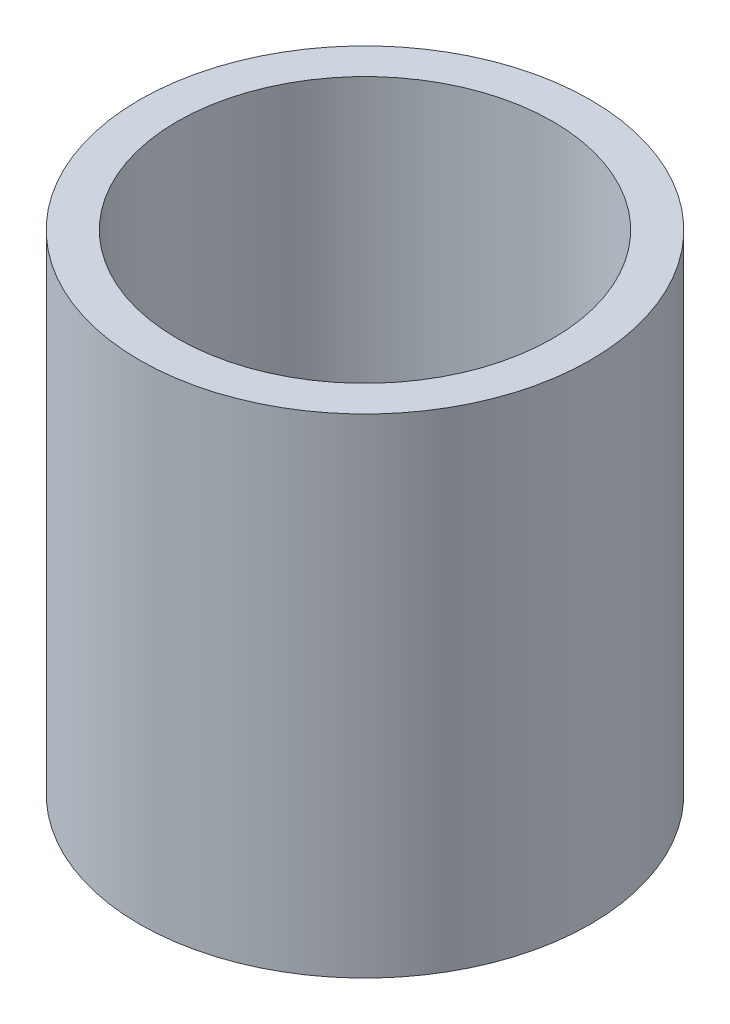
ISO-10303-21;
HEADER;
FILE_DESCRIPTION(('STEP AP214'),'2;1');
FILE_NAME('part.step','',(''),(''),'','','');
FILE_SCHEMA(('AUTOMOTIVE_DESIGN { 1 0 10303 214 1 1 1 1 }'));
ENDSEC;
DATA;
#1=APPLICATION_CONTEXT('core data for automotive mechanical design processes');
#2=APPLICATION_PROTOCOL_DEFINITION('international standard','automotive_design',2000,#1);
#3=PRODUCT_CONTEXT('',#1,'mechanical');
#4=PRODUCT('Part','Part','',(#3));
#5=PRODUCT_RELATED_PRODUCT_CATEGORY('part','',(#4));
#6=PRODUCT_DEFINITION_FORMATION('','',#4);
#7=PRODUCT_DEFINITION_CONTEXT('part definition',#1,'design');
#8=PRODUCT_DEFINITION('design','',#6,#7);
#9=PRODUCT_DEFINITION_SHAPE('','',#8);
#10=(LENGTH_UNIT() NAMED_UNIT(*) SI_UNIT(.MILLI.,.METRE.));
#11=(NAMED_UNIT(*) PLANE_ANGLE_UNIT() SI_UNIT($,.RADIAN.));
#12=(NAMED_UNIT(*) SI_UNIT($,.STERADIAN.) SOLID_ANGLE_UNIT());
#13=UNCERTAINTY_MEASURE_WITH_UNIT(LENGTH_MEASURE(1.E-05),#10,'distance_accuracy_value','');
#14=(GEOMETRIC_REPRESENTATION_CONTEXT(3) GLOBAL_UNCERTAINTY_ASSIGNED_CONTEXT((#13)) GLOBAL_UNIT_ASSIGNED_CONTEXT((#10,
#11,#12)) REPRESENTATION_CONTEXT('',''));
#15=CARTESIAN_POINT('',(0.,0.,0.));
#16=DIRECTION('',(0.,0.,1.));
#17=DIRECTION('',(1.,0.,0.));
#18=AXIS2_PLACEMENT_3D('',#15,#16,#17);
#19=CARTESIAN_POINT('',(0.,10.32,0.));
#20=DIRECTION('',(0.,1.,0.));
#21=DIRECTION('',(0.,0.,1.));
#22=AXIS2_PLACEMENT_3D('',#19,#20,#21);
#23=PLANE('',#22);
#24=CARTESIAN_POINT('',(0.,10.32,0.));
#25=DIRECTION('',(0.,1.,0.));
#26=DIRECTION('',(0.,0.,1.));
#27=AXIS2_PLACEMENT_3D('',#24,#25,#26);
#28=CIRCLE('',#27,4.7625);
#29=CARTESIAN_POINT('',(0.,10.32,4.7625));
#30=VERTEX_POINT('',#29);
#31=EDGE_CURVE('E10',#30,#30,#28,.T.);
#32=ORIENTED_EDGE('',*,*,#31,.T.);
#33=EDGE_LOOP('',(#32));
#34=FACE_BOUND('',#33,.T.);
#35=CARTESIAN_POINT('',(0.,10.32,0.));
#36=DIRECTION('',(0.,1.,0.));
#37=DIRECTION('',(0.,0.,1.));
#38=AXIS2_PLACEMENT_3D('',#35,#36,#37);
#39=CIRCLE('',#38,3.96875);
#40=CARTESIAN_POINT('',(0.,10.32,3.96875));
#41=VERTEX_POINT('',#40);
#42=EDGE_CURVE('E50',#41,#41,#39,.T.);
#43=ORIENTED_EDGE('',*,*,#42,.F.);
#44=EDGE_LOOP('',(#43));
#45=FACE_BOUND('',#44,.T.);
#46=ADVANCED_FACE('F37',(#34,#45),#23,.T.);
#47=CARTESIAN_POINT('',(0.,0.,0.));
#48=DIRECTION('',(0.,1.,0.));
#49=DIRECTION('',(0.,0.,1.));
#50=AXIS2_PLACEMENT_3D('',#47,#48,#49);
#51=PLANE('',#50);
#52=CARTESIAN_POINT('',(0.,0.,0.));
#53=DIRECTION('',(0.,1.,0.));
#54=DIRECTION('',(0.,0.,1.));
#55=AXIS2_PLACEMENT_3D('',#52,#53,#54);
#56=CIRCLE('',#55,4.7625);
#57=CARTESIAN_POINT('',(0.,0.,4.7625));
#58=VERTEX_POINT('',#57);
#59=EDGE_CURVE('E41',#58,#58,#56,.T.);
#60=ORIENTED_EDGE('',*,*,#59,.F.);
#61=EDGE_LOOP('',(#60));
#62=FACE_BOUND('',#61,.T.);
#63=CARTESIAN_POINT('',(0.,0.,0.));
#64=DIRECTION('',(0.,1.,0.));
#65=DIRECTION('',(0.,0.,1.));
#66=AXIS2_PLACEMENT_3D('',#63,#64,#65);
#67=CIRCLE('',#66,3.96875);
#68=CARTESIAN_POINT('',(0.,0.,3.96875));
#69=VERTEX_POINT('',#68);
#70=EDGE_CURVE('E52',#69,#69,#67,.T.);
#71=ORIENTED_EDGE('',*,*,#70,.T.);
#72=EDGE_LOOP('',(#71));
#73=FACE_BOUND('',#72,.T.);
#74=ADVANCED_FACE('F64',(#62,#73),#51,.F.);
#75=CARTESIAN_POINT('',(0.,10.32,0.));
#76=DIRECTION('',(0.,-1.,0.));
#77=DIRECTION('',(0.,0.,-1.));
#78=AXIS2_PLACEMENT_3D('',#75,#76,#77);
#79=CYLINDRICAL_SURFACE('',#78,4.7625);
#80=ORIENTED_EDGE('',*,*,#31,.F.);
#81=EDGE_LOOP('',(#80));
#82=FACE_BOUND('',#81,.T.);
#83=ORIENTED_EDGE('',*,*,#59,.T.);
#84=EDGE_LOOP('',(#83));
#85=FACE_BOUND('',#84,.T.);
#86=ADVANCED_FACE('F39',(#82,#85),#79,.T.);
#87=CARTESIAN_POINT('',(0.,10.32,0.));
#88=DIRECTION('',(0.,-1.,0.));
#89=DIRECTION('',(0.,0.,-1.));
#90=AXIS2_PLACEMENT_3D('',#87,#88,#89);
#91=CYLINDRICAL_SURFACE('',#90,3.96875);
#92=ORIENTED_EDGE('',*,*,#42,.T.);
#93=EDGE_LOOP('',(#92));
#94=FACE_BOUND('',#93,.T.);
#95=ORIENTED_EDGE('',*,*,#70,.F.);
#96=EDGE_LOOP('',(#95));
#97=FACE_BOUND('',#96,.T.);
#98=ADVANCED_FACE('F60',(#94,#97),#91,.F.);
#99=CLOSED_SHELL('',(#46,#74,#86,#98));
#100=MANIFOLD_SOLID_BREP('B2',#99);
#101=ADVANCED_BREP_SHAPE_REPRESENTATION('',(#18,#100),#14);
#102=SHAPE_DEFINITION_REPRESENTATION(#9,#101);
ENDSEC;
END-ISO-10303-21;
